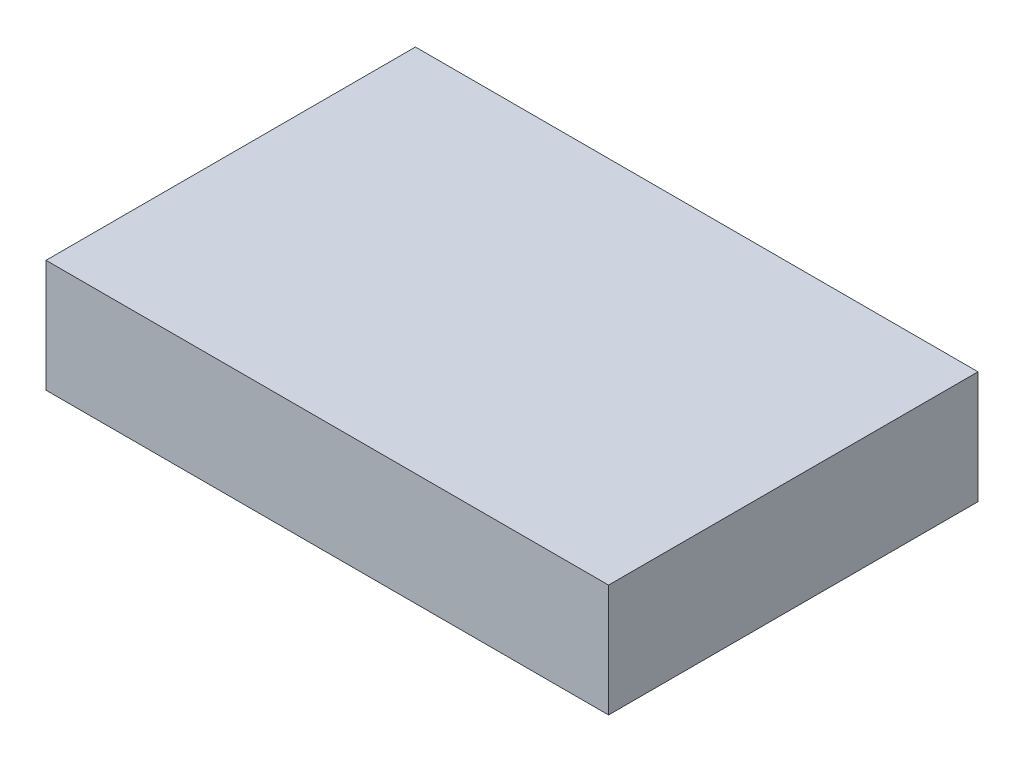
ISO-10303-21;
HEADER;
FILE_DESCRIPTION(('STEP AP214'),'2;1');
FILE_NAME('part.step','',(''),(''),'','','');
FILE_SCHEMA(('AUTOMOTIVE_DESIGN { 1 0 10303 214 1 1 1 1 }'));
ENDSEC;
DATA;
#1=APPLICATION_CONTEXT('core data for automotive mechanical design processes');
#2=APPLICATION_PROTOCOL_DEFINITION('international standard','automotive_design',2000,#1);
#3=PRODUCT_CONTEXT('',#1,'mechanical');
#4=PRODUCT('Part','Part','',(#3));
#5=PRODUCT_RELATED_PRODUCT_CATEGORY('part','',(#4));
#6=PRODUCT_DEFINITION_FORMATION('','',#4);
#7=PRODUCT_DEFINITION_CONTEXT('part definition',#1,'design');
#8=PRODUCT_DEFINITION('design','',#6,#7);
#9=PRODUCT_DEFINITION_SHAPE('','',#8);
#10=(LENGTH_UNIT() NAMED_UNIT(*) SI_UNIT(.MILLI.,.METRE.));
#11=(NAMED_UNIT(*) PLANE_ANGLE_UNIT() SI_UNIT($,.RADIAN.));
#12=(NAMED_UNIT(*) SI_UNIT($,.STERADIAN.) SOLID_ANGLE_UNIT());
#13=UNCERTAINTY_MEASURE_WITH_UNIT(LENGTH_MEASURE(1.E-05),#10,'distance_accuracy_value','');
#14=(GEOMETRIC_REPRESENTATION_CONTEXT(3) GLOBAL_UNCERTAINTY_ASSIGNED_CONTEXT((#13)) GLOBAL_UNIT_ASSIGNED_CONTEXT((#10,
#11,#12)) REPRESENTATION_CONTEXT('',''));
#15=CARTESIAN_POINT('',(0.,0.,0.));
#16=DIRECTION('',(0.,0.,1.));
#17=DIRECTION('',(1.,0.,0.));
#18=AXIS2_PLACEMENT_3D('',#15,#16,#17);
#19=CARTESIAN_POINT('',(0.,17.018,0.));
#20=DIRECTION('',(1.,0.,0.));
#21=DIRECTION('',(0.,0.,-1.));
#22=AXIS2_PLACEMENT_3D('',#19,#20,#21);
#23=PLANE('',#22);
#24=DIRECTION('',(0.,0.,1.));
#25=VECTOR('',#24,1.);
#26=CARTESIAN_POINT('',(0.,0.,0.));
#27=LINE('',#26,#25);
#28=CARTESIAN_POINT('',(0.,0.,-55.88));
#29=VERTEX_POINT('',#28);
#30=CARTESIAN_POINT('',(0.,0.,0.));
#31=VERTEX_POINT('',#30);
#32=EDGE_CURVE('E98',#29,#31,#27,.T.);
#33=ORIENTED_EDGE('',*,*,#32,.T.);
#34=DIRECTION('',(0.,-1.,0.));
#35=VECTOR('',#34,1.);
#36=CARTESIAN_POINT('',(0.,17.018,0.));
#37=LINE('',#36,#35);
#38=CARTESIAN_POINT('',(0.,17.018,0.));
#39=VERTEX_POINT('',#38);
#40=EDGE_CURVE('E11',#39,#31,#37,.T.);
#41=ORIENTED_EDGE('',*,*,#40,.F.);
#42=DIRECTION('',(0.,0.,1.));
#43=VECTOR('',#42,1.);
#44=CARTESIAN_POINT('',(0.,17.018,0.));
#45=LINE('',#44,#43);
#46=CARTESIAN_POINT('',(0.,17.018,-55.88));
#47=VERTEX_POINT('',#46);
#48=EDGE_CURVE('E86',#47,#39,#45,.T.);
#49=ORIENTED_EDGE('',*,*,#48,.F.);
#50=DIRECTION('',(0.,-1.,0.));
#51=VECTOR('',#50,1.);
#52=CARTESIAN_POINT('',(0.,17.018,-55.88));
#53=LINE('',#52,#51);
#54=EDGE_CURVE('E94',#47,#29,#53,.T.);
#55=ORIENTED_EDGE('',*,*,#54,.T.);
#56=EDGE_LOOP('',(#33,#41,#49,#55));
#57=FACE_BOUND('',#56,.T.);
#58=ADVANCED_FACE('F35',(#57),#23,.F.);
#59=CARTESIAN_POINT('',(0.,17.018,0.));
#60=DIRECTION('',(0.,0.,-1.));
#61=DIRECTION('',(-1.,0.,0.));
#62=AXIS2_PLACEMENT_3D('',#59,#60,#61);
#63=PLANE('',#62);
#64=DIRECTION('',(1.,0.,0.));
#65=VECTOR('',#64,1.);
#66=CARTESIAN_POINT('',(0.,0.,0.));
#67=LINE('',#66,#65);
#68=CARTESIAN_POINT('',(85.09,0.,0.));
#69=VERTEX_POINT('',#68);
#70=EDGE_CURVE('E90',#31,#69,#67,.T.);
#71=ORIENTED_EDGE('',*,*,#70,.T.);
#72=DIRECTION('',(0.,-1.,0.));
#73=VECTOR('',#72,1.);
#74=CARTESIAN_POINT('',(85.09,17.018,0.));
#75=LINE('',#74,#73);
#76=CARTESIAN_POINT('',(85.09,17.018,0.));
#77=VERTEX_POINT('',#76);
#78=EDGE_CURVE('E43',#77,#69,#75,.T.);
#79=ORIENTED_EDGE('',*,*,#78,.F.);
#80=DIRECTION('',(1.,0.,0.));
#81=VECTOR('',#80,1.);
#82=CARTESIAN_POINT('',(0.,17.018,0.));
#83=LINE('',#82,#81);
#84=EDGE_CURVE('E81',#39,#77,#83,.T.);
#85=ORIENTED_EDGE('',*,*,#84,.F.);
#86=ORIENTED_EDGE('',*,*,#40,.T.);
#87=EDGE_LOOP('',(#71,#79,#85,#86));
#88=FACE_BOUND('',#87,.T.);
#89=ADVANCED_FACE('F89',(#88),#63,.F.);
#90=CARTESIAN_POINT('',(85.09,17.018,0.));
#91=DIRECTION('',(-1.,0.,0.));
#92=DIRECTION('',(0.,0.,1.));
#93=AXIS2_PLACEMENT_3D('',#90,#91,#92);
#94=PLANE('',#93);
#95=DIRECTION('',(0.,0.,-1.));
#96=VECTOR('',#95,1.);
#97=CARTESIAN_POINT('',(85.09,0.,0.));
#98=LINE('',#97,#96);
#99=CARTESIAN_POINT('',(85.09,0.,-55.88));
#100=VERTEX_POINT('',#99);
#101=EDGE_CURVE('E68',#69,#100,#98,.T.);
#102=ORIENTED_EDGE('',*,*,#101,.T.);
#103=DIRECTION('',(0.,-1.,0.));
#104=VECTOR('',#103,1.);
#105=CARTESIAN_POINT('',(85.09,17.018,-55.88));
#106=LINE('',#105,#104);
#107=CARTESIAN_POINT('',(85.09,17.018,-55.88));
#108=VERTEX_POINT('',#107);
#109=EDGE_CURVE('E91',#108,#100,#106,.T.);
#110=ORIENTED_EDGE('',*,*,#109,.F.);
#111=DIRECTION('',(0.,0.,-1.));
#112=VECTOR('',#111,1.);
#113=CARTESIAN_POINT('',(85.09,17.018,0.));
#114=LINE('',#113,#112);
#115=EDGE_CURVE('E84',#77,#108,#114,.T.);
#116=ORIENTED_EDGE('',*,*,#115,.F.);
#117=ORIENTED_EDGE('',*,*,#78,.T.);
#118=EDGE_LOOP('',(#102,#110,#116,#117));
#119=FACE_BOUND('',#118,.T.);
#120=ADVANCED_FACE('F92',(#119),#94,.F.);
#121=CARTESIAN_POINT('',(0.,17.018,-55.88));
#122=DIRECTION('',(0.,0.,1.));
#123=DIRECTION('',(1.,0.,0.));
#124=AXIS2_PLACEMENT_3D('',#121,#122,#123);
#125=PLANE('',#124);
#126=DIRECTION('',(-1.,0.,0.));
#127=VECTOR('',#126,1.);
#128=CARTESIAN_POINT('',(0.,0.,-55.88));
#129=LINE('',#128,#127);
#130=EDGE_CURVE('E74',#100,#29,#129,.T.);
#131=ORIENTED_EDGE('',*,*,#130,.T.);
#132=ORIENTED_EDGE('',*,*,#54,.F.);
#133=DIRECTION('',(-1.,0.,0.));
#134=VECTOR('',#133,1.);
#135=CARTESIAN_POINT('',(0.,17.018,-55.88));
#136=LINE('',#135,#134);
#137=EDGE_CURVE('E51',#108,#47,#136,.T.);
#138=ORIENTED_EDGE('',*,*,#137,.F.);
#139=ORIENTED_EDGE('',*,*,#109,.T.);
#140=EDGE_LOOP('',(#131,#132,#138,#139));
#141=FACE_BOUND('',#140,.T.);
#142=ADVANCED_FACE('F105',(#141),#125,.F.);
#143=CARTESIAN_POINT('',(0.,17.018,0.));
#144=DIRECTION('',(0.,-1.,0.));
#145=DIRECTION('',(0.,0.,-1.));
#146=AXIS2_PLACEMENT_3D('',#143,#144,#145);
#147=PLANE('',#146);
#148=ORIENTED_EDGE('',*,*,#48,.T.);
#149=ORIENTED_EDGE('',*,*,#84,.T.);
#150=ORIENTED_EDGE('',*,*,#115,.T.);
#151=ORIENTED_EDGE('',*,*,#137,.T.);
#152=EDGE_LOOP('',(#148,#149,#150,#151));
#153=FACE_BOUND('',#152,.T.);
#154=ADVANCED_FACE('F82',(#153),#147,.F.);
#155=CARTESIAN_POINT('',(0.,0.,0.));
#156=DIRECTION('',(0.,-1.,0.));
#157=DIRECTION('',(0.,0.,-1.));
#158=AXIS2_PLACEMENT_3D('',#155,#156,#157);
#159=PLANE('',#158);
#160=ORIENTED_EDGE('',*,*,#32,.F.);
#161=ORIENTED_EDGE('',*,*,#130,.F.);
#162=ORIENTED_EDGE('',*,*,#101,.F.);
#163=ORIENTED_EDGE('',*,*,#70,.F.);
#164=EDGE_LOOP('',(#160,#161,#162,#163));
#165=FACE_BOUND('',#164,.T.);
#166=ADVANCED_FACE('F108',(#165),#159,.T.);
#167=CLOSED_SHELL('',(#58,#89,#120,#142,#154,#166));
#168=MANIFOLD_SOLID_BREP('B2',#167);
#169=ADVANCED_BREP_SHAPE_REPRESENTATION('',(#18,#168),#14);
#170=SHAPE_DEFINITION_REPRESENTATION(#9,#169);
ENDSEC;
END-ISO-10303-21;
